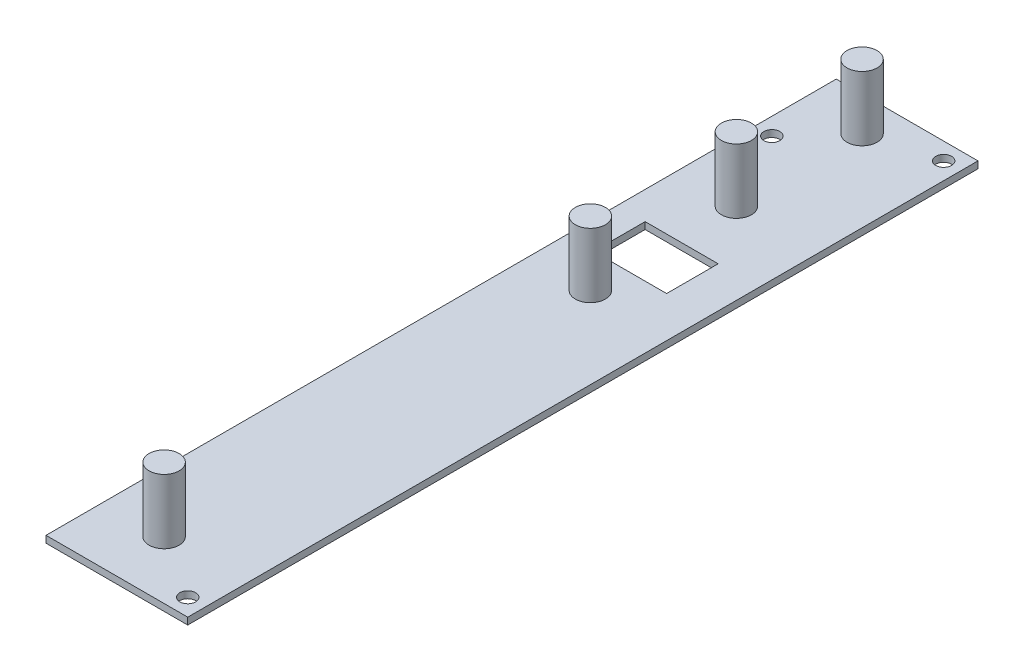
ISO-10303-21;
HEADER;
FILE_DESCRIPTION(('STEP AP214'),'2;1');
FILE_NAME('part.step','',(''),(''),'','','');
FILE_SCHEMA(('AUTOMOTIVE_DESIGN { 1 0 10303 214 1 1 1 1 }'));
ENDSEC;
DATA;
#1=APPLICATION_CONTEXT('core data for automotive mechanical design processes');
#2=APPLICATION_PROTOCOL_DEFINITION('international standard','automotive_design',2000,#1);
#3=PRODUCT_CONTEXT('',#1,'mechanical');
#4=PRODUCT('Part','Part','',(#3));
#5=PRODUCT_RELATED_PRODUCT_CATEGORY('part','',(#4));
#6=PRODUCT_DEFINITION_FORMATION('','',#4);
#7=PRODUCT_DEFINITION_CONTEXT('part definition',#1,'design');
#8=PRODUCT_DEFINITION('design','',#6,#7);
#9=PRODUCT_DEFINITION_SHAPE('','',#8);
#10=(LENGTH_UNIT() NAMED_UNIT(*) SI_UNIT(.MILLI.,.METRE.));
#11=(NAMED_UNIT(*) PLANE_ANGLE_UNIT() SI_UNIT($,.RADIAN.));
#12=(NAMED_UNIT(*) SI_UNIT($,.STERADIAN.) SOLID_ANGLE_UNIT());
#13=UNCERTAINTY_MEASURE_WITH_UNIT(LENGTH_MEASURE(1.E-05),#10,'distance_accuracy_value','');
#14=(GEOMETRIC_REPRESENTATION_CONTEXT(3) GLOBAL_UNCERTAINTY_ASSIGNED_CONTEXT((#13)) GLOBAL_UNIT_ASSIGNED_CONTEXT((#10,
#11,#12)) REPRESENTATION_CONTEXT('',''));
#15=CARTESIAN_POINT('',(0.,0.,0.));
#16=DIRECTION('',(0.,0.,1.));
#17=DIRECTION('',(1.,0.,0.));
#18=AXIS2_PLACEMENT_3D('',#15,#16,#17);
#19=CARTESIAN_POINT('',(16.5,1.6,-92.));
#20=DIRECTION('',(-1.,0.,0.));
#21=DIRECTION('',(0.,0.,1.));
#22=AXIS2_PLACEMENT_3D('',#19,#20,#21);
#23=PLANE('',#22);
#24=DIRECTION('',(0.,0.,-1.));
#25=VECTOR('',#24,1.);
#26=CARTESIAN_POINT('',(16.5,0.,-92.));
#27=LINE('',#26,#25);
#28=CARTESIAN_POINT('',(16.5,0.,92.));
#29=VERTEX_POINT('',#28);
#30=CARTESIAN_POINT('',(16.5,0.,-92.));
#31=VERTEX_POINT('',#30);
#32=EDGE_CURVE('E173',#29,#31,#27,.T.);
#33=ORIENTED_EDGE('',*,*,#32,.T.);
#34=DIRECTION('',(0.,-1.,0.));
#35=VECTOR('',#34,1.);
#36=CARTESIAN_POINT('',(16.5,1.6,-92.));
#37=LINE('',#36,#35);
#38=CARTESIAN_POINT('',(16.5,1.6,-92.));
#39=VERTEX_POINT('',#38);
#40=EDGE_CURVE('E11',#39,#31,#37,.T.);
#41=ORIENTED_EDGE('',*,*,#40,.F.);
#42=DIRECTION('',(0.,0.,-1.));
#43=VECTOR('',#42,1.);
#44=CARTESIAN_POINT('',(16.5,1.6,-92.));
#45=LINE('',#44,#43);
#46=CARTESIAN_POINT('',(16.5,1.6,92.));
#47=VERTEX_POINT('',#46);
#48=EDGE_CURVE('E176',#47,#39,#45,.T.);
#49=ORIENTED_EDGE('',*,*,#48,.F.);
#50=DIRECTION('',(0.,-1.,0.));
#51=VECTOR('',#50,1.);
#52=CARTESIAN_POINT('',(16.5,1.6,92.));
#53=LINE('',#52,#51);
#54=EDGE_CURVE('E186',#47,#29,#53,.T.);
#55=ORIENTED_EDGE('',*,*,#54,.T.);
#56=EDGE_LOOP('',(#33,#41,#49,#55));
#57=FACE_BOUND('',#56,.T.);
#58=ADVANCED_FACE('F33',(#57),#23,.F.);
#59=CARTESIAN_POINT('',(-16.5,1.6,-92.));
#60=DIRECTION('',(0.,0.,1.));
#61=DIRECTION('',(1.,0.,0.));
#62=AXIS2_PLACEMENT_3D('',#59,#60,#61);
#63=PLANE('',#62);
#64=DIRECTION('',(-1.,0.,0.));
#65=VECTOR('',#64,1.);
#66=CARTESIAN_POINT('',(-16.5,0.,-92.));
#67=LINE('',#66,#65);
#68=CARTESIAN_POINT('',(-16.5,0.,-92.));
#69=VERTEX_POINT('',#68);
#70=EDGE_CURVE('E189',#31,#69,#67,.T.);
#71=ORIENTED_EDGE('',*,*,#70,.T.);
#72=DIRECTION('',(0.,-1.,0.));
#73=VECTOR('',#72,1.);
#74=CARTESIAN_POINT('',(-16.5,1.6,-92.));
#75=LINE('',#74,#73);
#76=CARTESIAN_POINT('',(-16.5,1.6,-92.));
#77=VERTEX_POINT('',#76);
#78=EDGE_CURVE('E40',#77,#69,#75,.T.);
#79=ORIENTED_EDGE('',*,*,#78,.F.);
#80=DIRECTION('',(-1.,0.,0.));
#81=VECTOR('',#80,1.);
#82=CARTESIAN_POINT('',(-16.5,1.6,-92.));
#83=LINE('',#82,#81);
#84=EDGE_CURVE('E179',#39,#77,#83,.T.);
#85=ORIENTED_EDGE('',*,*,#84,.F.);
#86=ORIENTED_EDGE('',*,*,#40,.T.);
#87=EDGE_LOOP('',(#71,#79,#85,#86));
#88=FACE_BOUND('',#87,.T.);
#89=ADVANCED_FACE('F218',(#88),#63,.F.);
#90=CARTESIAN_POINT('',(-16.5,1.6,-92.));
#91=DIRECTION('',(1.,0.,0.));
#92=DIRECTION('',(0.,0.,-1.));
#93=AXIS2_PLACEMENT_3D('',#90,#91,#92);
#94=PLANE('',#93);
#95=DIRECTION('',(0.,0.,1.));
#96=VECTOR('',#95,1.);
#97=CARTESIAN_POINT('',(-16.5,0.,-92.));
#98=LINE('',#97,#96);
#99=CARTESIAN_POINT('',(-16.5,0.,92.));
#100=VERTEX_POINT('',#99);
#101=EDGE_CURVE('E191',#69,#100,#98,.T.);
#102=ORIENTED_EDGE('',*,*,#101,.T.);
#103=DIRECTION('',(0.,-1.,0.));
#104=VECTOR('',#103,1.);
#105=CARTESIAN_POINT('',(-16.5,1.6,92.));
#106=LINE('',#105,#104);
#107=CARTESIAN_POINT('',(-16.5,1.6,92.));
#108=VERTEX_POINT('',#107);
#109=EDGE_CURVE('E196',#108,#100,#106,.T.);
#110=ORIENTED_EDGE('',*,*,#109,.F.);
#111=DIRECTION('',(0.,0.,1.));
#112=VECTOR('',#111,1.);
#113=CARTESIAN_POINT('',(-16.5,1.6,-92.));
#114=LINE('',#113,#112);
#115=EDGE_CURVE('E182',#77,#108,#114,.T.);
#116=ORIENTED_EDGE('',*,*,#115,.F.);
#117=ORIENTED_EDGE('',*,*,#78,.T.);
#118=EDGE_LOOP('',(#102,#110,#116,#117));
#119=FACE_BOUND('',#118,.T.);
#120=ADVANCED_FACE('F203',(#119),#94,.F.);
#121=CARTESIAN_POINT('',(-16.5,1.6,92.));
#122=DIRECTION('',(0.,0.,-1.));
#123=DIRECTION('',(-1.,0.,0.));
#124=AXIS2_PLACEMENT_3D('',#121,#122,#123);
#125=PLANE('',#124);
#126=DIRECTION('',(1.,0.,0.));
#127=VECTOR('',#126,1.);
#128=CARTESIAN_POINT('',(-16.5,0.,92.));
#129=LINE('',#128,#127);
#130=EDGE_CURVE('E180',#100,#29,#129,.T.);
#131=ORIENTED_EDGE('',*,*,#130,.T.);
#132=ORIENTED_EDGE('',*,*,#54,.F.);
#133=DIRECTION('',(1.,0.,0.));
#134=VECTOR('',#133,1.);
#135=CARTESIAN_POINT('',(-16.5,1.6,92.));
#136=LINE('',#135,#134);
#137=EDGE_CURVE('E184',#108,#47,#136,.T.);
#138=ORIENTED_EDGE('',*,*,#137,.F.);
#139=ORIENTED_EDGE('',*,*,#109,.T.);
#140=EDGE_LOOP('',(#131,#132,#138,#139));
#141=FACE_BOUND('',#140,.T.);
#142=ADVANCED_FACE('F211',(#141),#125,.F.);
#143=CARTESIAN_POINT('',(0.,1.6,0.));
#144=DIRECTION('',(0.,1.,0.));
#145=DIRECTION('',(0.,0.,1.));
#146=AXIS2_PLACEMENT_3D('',#143,#144,#145);
#147=PLANE('',#146);
#148=DIRECTION('',(0.,0.,1.));
#149=VECTOR('',#148,1.);
#150=CARTESIAN_POINT('',(-10.,1.6,-41.));
#151=LINE('',#150,#149);
#152=CARTESIAN_POINT('',(-10.,1.6,-41.));
#153=VERTEX_POINT('',#152);
#154=CARTESIAN_POINT('',(-10.,1.6,-29.));
#155=VERTEX_POINT('',#154);
#156=EDGE_CURVE('E47',#153,#155,#151,.T.);
#157=ORIENTED_EDGE('',*,*,#156,.F.);
#158=DIRECTION('',(-1.,0.,0.));
#159=VECTOR('',#158,1.);
#160=CARTESIAN_POINT('',(-10.,1.6,-41.));
#161=LINE('',#160,#159);
#162=CARTESIAN_POINT('',(6.99999999999998,1.6,-41.));
#163=VERTEX_POINT('',#162);
#164=EDGE_CURVE('E115',#163,#153,#161,.T.);
#165=ORIENTED_EDGE('',*,*,#164,.F.);
#166=DIRECTION('',(0.,0.,-1.));
#167=VECTOR('',#166,1.);
#168=CARTESIAN_POINT('',(6.99999999999998,1.6,-41.));
#169=LINE('',#168,#167);
#170=CARTESIAN_POINT('',(6.99999999999998,1.6,-29.));
#171=VERTEX_POINT('',#170);
#172=EDGE_CURVE('E118',#171,#163,#169,.T.);
#173=ORIENTED_EDGE('',*,*,#172,.F.);
#174=DIRECTION('',(1.,0.,0.));
#175=VECTOR('',#174,1.);
#176=CARTESIAN_POINT('',(-10.,1.6,-29.));
#177=LINE('',#176,#175);
#178=EDGE_CURVE('E124',#155,#171,#177,.T.);
#179=ORIENTED_EDGE('',*,*,#178,.F.);
#180=EDGE_LOOP('',(#157,#165,#173,#179));
#181=FACE_BOUND('',#180,.T.);
#182=CARTESIAN_POINT('',(-2.50000000000002,1.6,78.5));
#183=DIRECTION('',(0.,1.,0.));
#184=DIRECTION('',(0.,0.,1.));
#185=AXIS2_PLACEMENT_3D('',#182,#183,#184);
#186=CIRCLE('',#185,3.5);
#187=CARTESIAN_POINT('',(-2.50000000000002,1.6,82.));
#188=VERTEX_POINT('',#187);
#189=EDGE_CURVE('E130',#188,#188,#186,.T.);
#190=ORIENTED_EDGE('',*,*,#189,.F.);
#191=EDGE_LOOP('',(#190));
#192=FACE_BOUND('',#191,.T.);
#193=CARTESIAN_POINT('',(-2.50000000000002,1.6,-54.75));
#194=DIRECTION('',(0.,1.,0.));
#195=DIRECTION('',(0.,0.,1.));
#196=AXIS2_PLACEMENT_3D('',#193,#194,#195);
#197=CIRCLE('',#196,3.5);
#198=CARTESIAN_POINT('',(-2.50000000000002,1.6,-51.25));
#199=VERTEX_POINT('',#198);
#200=EDGE_CURVE('E137',#199,#199,#197,.T.);
#201=ORIENTED_EDGE('',*,*,#200,.F.);
#202=EDGE_LOOP('',(#201));
#203=FACE_BOUND('',#202,.T.);
#204=CARTESIAN_POINT('',(-2.50000000000002,1.6,-20.75));
#205=DIRECTION('',(0.,1.,0.));
#206=DIRECTION('',(0.,0.,1.));
#207=AXIS2_PLACEMENT_3D('',#204,#205,#206);
#208=CIRCLE('',#207,3.5);
#209=CARTESIAN_POINT('',(-2.50000000000002,1.6,-17.25));
#210=VERTEX_POINT('',#209);
#211=EDGE_CURVE('E143',#210,#210,#208,.T.);
#212=ORIENTED_EDGE('',*,*,#211,.F.);
#213=EDGE_LOOP('',(#212));
#214=FACE_BOUND('',#213,.T.);
#215=CARTESIAN_POINT('',(-2.50000000000002,1.6,-84.));
#216=DIRECTION('',(0.,1.,0.));
#217=DIRECTION('',(0.,0.,1.));
#218=AXIS2_PLACEMENT_3D('',#215,#216,#217);
#219=CIRCLE('',#218,3.5);
#220=CARTESIAN_POINT('',(-2.50000000000002,1.6,-80.5));
#221=VERTEX_POINT('',#220);
#222=EDGE_CURVE('E149',#221,#221,#219,.T.);
#223=ORIENTED_EDGE('',*,*,#222,.F.);
#224=EDGE_LOOP('',(#223));
#225=FACE_BOUND('',#224,.T.);
#226=CARTESIAN_POINT('',(12.5,1.6,-88.));
#227=DIRECTION('',(0.,1.,0.));
#228=DIRECTION('',(0.,0.,1.));
#229=AXIS2_PLACEMENT_3D('',#226,#227,#228);
#230=CIRCLE('',#229,1.85000000000001);
#231=CARTESIAN_POINT('',(12.5,1.6,-86.15));
#232=VERTEX_POINT('',#231);
#233=EDGE_CURVE('E162',#232,#232,#230,.T.);
#234=ORIENTED_EDGE('',*,*,#233,.F.);
#235=EDGE_LOOP('',(#234));
#236=FACE_BOUND('',#235,.T.);
#237=CARTESIAN_POINT('',(12.5,1.6,88.));
#238=DIRECTION('',(0.,1.,0.));
#239=DIRECTION('',(0.,0.,1.));
#240=AXIS2_PLACEMENT_3D('',#237,#238,#239);
#241=CIRCLE('',#240,1.85000000000001);
#242=CARTESIAN_POINT('',(12.5,1.6,89.85));
#243=VERTEX_POINT('',#242);
#244=EDGE_CURVE('E155',#243,#243,#241,.T.);
#245=ORIENTED_EDGE('',*,*,#244,.F.);
#246=EDGE_LOOP('',(#245));
#247=FACE_BOUND('',#246,.T.);
#248=CARTESIAN_POINT('',(-12.5,1.6,-73.));
#249=DIRECTION('',(0.,1.,0.));
#250=DIRECTION('',(0.,0.,1.));
#251=AXIS2_PLACEMENT_3D('',#248,#249,#250);
#252=CIRCLE('',#251,1.85000000000001);
#253=CARTESIAN_POINT('',(-12.5,1.6,-71.15));
#254=VERTEX_POINT('',#253);
#255=EDGE_CURVE('E161',#254,#254,#252,.T.);
#256=ORIENTED_EDGE('',*,*,#255,.F.);
#257=EDGE_LOOP('',(#256));
#258=FACE_BOUND('',#257,.T.);
#259=ORIENTED_EDGE('',*,*,#48,.T.);
#260=ORIENTED_EDGE('',*,*,#84,.T.);
#261=ORIENTED_EDGE('',*,*,#115,.T.);
#262=ORIENTED_EDGE('',*,*,#137,.T.);
#263=EDGE_LOOP('',(#259,#260,#261,#262));
#264=FACE_BOUND('',#263,.T.);
#265=ADVANCED_FACE('F217',(#181,#192,#203,#214,#225,#236,#247,#258,#264),#147,.T.);
#266=CARTESIAN_POINT('',(0.,0.,0.));
#267=DIRECTION('',(0.,1.,0.));
#268=DIRECTION('',(0.,0.,1.));
#269=AXIS2_PLACEMENT_3D('',#266,#267,#268);
#270=PLANE('',#269);
#271=DIRECTION('',(-1.,0.,0.));
#272=VECTOR('',#271,1.);
#273=CARTESIAN_POINT('',(-10.,0.,-41.));
#274=LINE('',#273,#272);
#275=CARTESIAN_POINT('',(6.99999999999998,0.,-41.));
#276=VERTEX_POINT('',#275);
#277=CARTESIAN_POINT('',(-10.,0.,-41.));
#278=VERTEX_POINT('',#277);
#279=EDGE_CURVE('E105',#276,#278,#274,.T.);
#280=ORIENTED_EDGE('',*,*,#279,.T.);
#281=DIRECTION('',(0.,0.,1.));
#282=VECTOR('',#281,1.);
#283=CARTESIAN_POINT('',(-10.,0.,-41.));
#284=LINE('',#283,#282);
#285=CARTESIAN_POINT('',(-10.,0.,-29.));
#286=VERTEX_POINT('',#285);
#287=EDGE_CURVE('E99',#278,#286,#284,.T.);
#288=ORIENTED_EDGE('',*,*,#287,.T.);
#289=DIRECTION('',(1.,0.,0.));
#290=VECTOR('',#289,1.);
#291=CARTESIAN_POINT('',(-10.,0.,-29.));
#292=LINE('',#291,#290);
#293=CARTESIAN_POINT('',(6.99999999999998,0.,-29.));
#294=VERTEX_POINT('',#293);
#295=EDGE_CURVE('E108',#286,#294,#292,.T.);
#296=ORIENTED_EDGE('',*,*,#295,.T.);
#297=DIRECTION('',(0.,0.,-1.));
#298=VECTOR('',#297,1.);
#299=CARTESIAN_POINT('',(6.99999999999998,0.,-41.));
#300=LINE('',#299,#298);
#301=EDGE_CURVE('E55',#294,#276,#300,.T.);
#302=ORIENTED_EDGE('',*,*,#301,.T.);
#303=EDGE_LOOP('',(#280,#288,#296,#302));
#304=FACE_BOUND('',#303,.T.);
#305=CARTESIAN_POINT('',(12.5,0.,-88.));
#306=DIRECTION('',(0.,1.,0.));
#307=DIRECTION('',(0.,0.,1.));
#308=AXIS2_PLACEMENT_3D('',#305,#306,#307);
#309=CIRCLE('',#308,1.85000000000001);
#310=CARTESIAN_POINT('',(12.5,0.,-86.15));
#311=VERTEX_POINT('',#310);
#312=EDGE_CURVE('E158',#311,#311,#309,.T.);
#313=ORIENTED_EDGE('',*,*,#312,.T.);
#314=EDGE_LOOP('',(#313));
#315=FACE_BOUND('',#314,.T.);
#316=CARTESIAN_POINT('',(12.5,0.,88.));
#317=DIRECTION('',(0.,1.,0.));
#318=DIRECTION('',(0.,0.,1.));
#319=AXIS2_PLACEMENT_3D('',#316,#317,#318);
#320=CIRCLE('',#319,1.85000000000001);
#321=CARTESIAN_POINT('',(12.5,0.,89.85));
#322=VERTEX_POINT('',#321);
#323=EDGE_CURVE('E165',#322,#322,#320,.T.);
#324=ORIENTED_EDGE('',*,*,#323,.T.);
#325=EDGE_LOOP('',(#324));
#326=FACE_BOUND('',#325,.T.);
#327=CARTESIAN_POINT('',(-12.5,0.,-73.));
#328=DIRECTION('',(0.,1.,0.));
#329=DIRECTION('',(0.,0.,1.));
#330=AXIS2_PLACEMENT_3D('',#327,#328,#329);
#331=CIRCLE('',#330,1.85000000000001);
#332=CARTESIAN_POINT('',(-12.5,0.,-71.15));
#333=VERTEX_POINT('',#332);
#334=EDGE_CURVE('E170',#333,#333,#331,.T.);
#335=ORIENTED_EDGE('',*,*,#334,.T.);
#336=EDGE_LOOP('',(#335));
#337=FACE_BOUND('',#336,.T.);
#338=ORIENTED_EDGE('',*,*,#32,.F.);
#339=ORIENTED_EDGE('',*,*,#130,.F.);
#340=ORIENTED_EDGE('',*,*,#101,.F.);
#341=ORIENTED_EDGE('',*,*,#70,.F.);
#342=EDGE_LOOP('',(#338,#339,#340,#341));
#343=FACE_BOUND('',#342,.T.);
#344=ADVANCED_FACE('F112',(#304,#315,#326,#337,#343),#270,.F.);
#345=CARTESIAN_POINT('',(-12.5,0.,-73.));
#346=DIRECTION('',(0.,1.,0.));
#347=DIRECTION('',(0.,0.,1.));
#348=AXIS2_PLACEMENT_3D('',#345,#346,#347);
#349=CYLINDRICAL_SURFACE('',#348,1.85000000000001);
#350=ORIENTED_EDGE('',*,*,#334,.F.);
#351=EDGE_LOOP('',(#350));
#352=FACE_BOUND('',#351,.T.);
#353=ORIENTED_EDGE('',*,*,#255,.T.);
#354=EDGE_LOOP('',(#353));
#355=FACE_BOUND('',#354,.T.);
#356=ADVANCED_FACE('F230',(#352,#355),#349,.F.);
#357=CARTESIAN_POINT('',(12.5,0.,88.));
#358=DIRECTION('',(0.,1.,0.));
#359=DIRECTION('',(0.,0.,1.));
#360=AXIS2_PLACEMENT_3D('',#357,#358,#359);
#361=CYLINDRICAL_SURFACE('',#360,1.85000000000001);
#362=ORIENTED_EDGE('',*,*,#323,.F.);
#363=EDGE_LOOP('',(#362));
#364=FACE_BOUND('',#363,.T.);
#365=ORIENTED_EDGE('',*,*,#244,.T.);
#366=EDGE_LOOP('',(#365));
#367=FACE_BOUND('',#366,.T.);
#368=ADVANCED_FACE('F236',(#364,#367),#361,.F.);
#369=CARTESIAN_POINT('',(12.5,0.,-88.));
#370=DIRECTION('',(0.,1.,0.));
#371=DIRECTION('',(0.,0.,1.));
#372=AXIS2_PLACEMENT_3D('',#369,#370,#371);
#373=CYLINDRICAL_SURFACE('',#372,1.85000000000001);
#374=ORIENTED_EDGE('',*,*,#312,.F.);
#375=EDGE_LOOP('',(#374));
#376=FACE_BOUND('',#375,.T.);
#377=ORIENTED_EDGE('',*,*,#233,.T.);
#378=EDGE_LOOP('',(#377));
#379=FACE_BOUND('',#378,.T.);
#380=ADVANCED_FACE('F240',(#376,#379),#373,.F.);
#381=CARTESIAN_POINT('',(-2.50000000000002,16.6,-84.));
#382=DIRECTION('',(0.,-1.,0.));
#383=DIRECTION('',(0.,0.,-1.));
#384=AXIS2_PLACEMENT_3D('',#381,#382,#383);
#385=CYLINDRICAL_SURFACE('',#384,3.5);
#386=CARTESIAN_POINT('',(-2.50000000000002,16.6,-84.));
#387=DIRECTION('',(0.,1.,0.));
#388=DIRECTION('',(0.,0.,1.));
#389=AXIS2_PLACEMENT_3D('',#386,#387,#388);
#390=CIRCLE('',#389,3.5);
#391=CARTESIAN_POINT('',(-2.50000000000002,16.6,-80.5));
#392=VERTEX_POINT('',#391);
#393=EDGE_CURVE('E152',#392,#392,#390,.T.);
#394=ORIENTED_EDGE('',*,*,#393,.F.);
#395=EDGE_LOOP('',(#394));
#396=FACE_BOUND('',#395,.T.);
#397=ORIENTED_EDGE('',*,*,#222,.T.);
#398=EDGE_LOOP('',(#397));
#399=FACE_BOUND('',#398,.T.);
#400=ADVANCED_FACE('F244',(#396,#399),#385,.T.);
#401=CARTESIAN_POINT('',(-2.50000000000002,16.6,-84.));
#402=DIRECTION('',(0.,1.,0.));
#403=DIRECTION('',(0.,0.,1.));
#404=AXIS2_PLACEMENT_3D('',#401,#402,#403);
#405=PLANE('',#404);
#406=ORIENTED_EDGE('',*,*,#393,.T.);
#407=EDGE_LOOP('',(#406));
#408=FACE_BOUND('',#407,.T.);
#409=ADVANCED_FACE('F248',(#408),#405,.T.);
#410=CARTESIAN_POINT('',(-2.50000000000002,16.6,-20.75));
#411=DIRECTION('',(0.,-1.,0.));
#412=DIRECTION('',(0.,0.,-1.));
#413=AXIS2_PLACEMENT_3D('',#410,#411,#412);
#414=CYLINDRICAL_SURFACE('',#413,3.5);
#415=CARTESIAN_POINT('',(-2.50000000000002,16.6,-20.75));
#416=DIRECTION('',(0.,1.,0.));
#417=DIRECTION('',(0.,0.,1.));
#418=AXIS2_PLACEMENT_3D('',#415,#416,#417);
#419=CIRCLE('',#418,3.5);
#420=CARTESIAN_POINT('',(-2.50000000000002,16.6,-17.25));
#421=VERTEX_POINT('',#420);
#422=EDGE_CURVE('E146',#421,#421,#419,.T.);
#423=ORIENTED_EDGE('',*,*,#422,.F.);
#424=EDGE_LOOP('',(#423));
#425=FACE_BOUND('',#424,.T.);
#426=ORIENTED_EDGE('',*,*,#211,.T.);
#427=EDGE_LOOP('',(#426));
#428=FACE_BOUND('',#427,.T.);
#429=ADVANCED_FACE('F252',(#425,#428),#414,.T.);
#430=CARTESIAN_POINT('',(-2.50000000000002,16.6,-20.75));
#431=DIRECTION('',(0.,1.,0.));
#432=DIRECTION('',(0.,0.,1.));
#433=AXIS2_PLACEMENT_3D('',#430,#431,#432);
#434=PLANE('',#433);
#435=ORIENTED_EDGE('',*,*,#422,.T.);
#436=EDGE_LOOP('',(#435));
#437=FACE_BOUND('',#436,.T.);
#438=ADVANCED_FACE('F256',(#437),#434,.T.);
#439=CARTESIAN_POINT('',(-2.50000000000002,16.6,-54.75));
#440=DIRECTION('',(0.,-1.,0.));
#441=DIRECTION('',(0.,0.,-1.));
#442=AXIS2_PLACEMENT_3D('',#439,#440,#441);
#443=CYLINDRICAL_SURFACE('',#442,3.5);
#444=CARTESIAN_POINT('',(-2.50000000000002,16.6,-54.75));
#445=DIRECTION('',(0.,1.,0.));
#446=DIRECTION('',(0.,0.,1.));
#447=AXIS2_PLACEMENT_3D('',#444,#445,#446);
#448=CIRCLE('',#447,3.5);
#449=CARTESIAN_POINT('',(-2.50000000000002,16.6,-51.25));
#450=VERTEX_POINT('',#449);
#451=EDGE_CURVE('E140',#450,#450,#448,.T.);
#452=ORIENTED_EDGE('',*,*,#451,.F.);
#453=EDGE_LOOP('',(#452));
#454=FACE_BOUND('',#453,.T.);
#455=ORIENTED_EDGE('',*,*,#200,.T.);
#456=EDGE_LOOP('',(#455));
#457=FACE_BOUND('',#456,.T.);
#458=ADVANCED_FACE('F260',(#454,#457),#443,.T.);
#459=CARTESIAN_POINT('',(-2.50000000000002,16.6,-54.75));
#460=DIRECTION('',(0.,1.,0.));
#461=DIRECTION('',(0.,0.,1.));
#462=AXIS2_PLACEMENT_3D('',#459,#460,#461);
#463=PLANE('',#462);
#464=ORIENTED_EDGE('',*,*,#451,.T.);
#465=EDGE_LOOP('',(#464));
#466=FACE_BOUND('',#465,.T.);
#467=ADVANCED_FACE('F264',(#466),#463,.T.);
#468=CARTESIAN_POINT('',(-2.50000000000002,16.6,78.5));
#469=DIRECTION('',(0.,-1.,0.));
#470=DIRECTION('',(0.,0.,-1.));
#471=AXIS2_PLACEMENT_3D('',#468,#469,#470);
#472=CYLINDRICAL_SURFACE('',#471,3.5);
#473=CARTESIAN_POINT('',(-2.50000000000002,16.6,78.5));
#474=DIRECTION('',(0.,1.,0.));
#475=DIRECTION('',(0.,0.,1.));
#476=AXIS2_PLACEMENT_3D('',#473,#474,#475);
#477=CIRCLE('',#476,3.5);
#478=CARTESIAN_POINT('',(-2.50000000000002,16.6,82.));
#479=VERTEX_POINT('',#478);
#480=EDGE_CURVE('E134',#479,#479,#477,.T.);
#481=ORIENTED_EDGE('',*,*,#480,.F.);
#482=EDGE_LOOP('',(#481));
#483=FACE_BOUND('',#482,.T.);
#484=ORIENTED_EDGE('',*,*,#189,.T.);
#485=EDGE_LOOP('',(#484));
#486=FACE_BOUND('',#485,.T.);
#487=ADVANCED_FACE('F268',(#483,#486),#472,.T.);
#488=CARTESIAN_POINT('',(-2.50000000000002,16.6,78.5));
#489=DIRECTION('',(0.,1.,0.));
#490=DIRECTION('',(0.,0.,1.));
#491=AXIS2_PLACEMENT_3D('',#488,#489,#490);
#492=PLANE('',#491);
#493=ORIENTED_EDGE('',*,*,#480,.T.);
#494=EDGE_LOOP('',(#493));
#495=FACE_BOUND('',#494,.T.);
#496=ADVANCED_FACE('F272',(#495),#492,.T.);
#497=CARTESIAN_POINT('',(-10.,0.,-41.));
#498=DIRECTION('',(-1.,0.,0.));
#499=DIRECTION('',(0.,0.,1.));
#500=AXIS2_PLACEMENT_3D('',#497,#498,#499);
#501=PLANE('',#500);
#502=ORIENTED_EDGE('',*,*,#156,.T.);
#503=DIRECTION('',(0.,1.,0.));
#504=VECTOR('',#503,1.);
#505=CARTESIAN_POINT('',(-10.,0.,-29.));
#506=LINE('',#505,#504);
#507=EDGE_CURVE('E95',#286,#155,#506,.T.);
#508=ORIENTED_EDGE('',*,*,#507,.F.);
#509=ORIENTED_EDGE('',*,*,#287,.F.);
#510=DIRECTION('',(0.,1.,0.));
#511=VECTOR('',#510,1.);
#512=CARTESIAN_POINT('',(-10.,0.,-41.));
#513=LINE('',#512,#511);
#514=EDGE_CURVE('E128',#278,#153,#513,.T.);
#515=ORIENTED_EDGE('',*,*,#514,.T.);
#516=EDGE_LOOP('',(#502,#508,#509,#515));
#517=FACE_BOUND('',#516,.T.);
#518=ADVANCED_FACE('F97',(#517),#501,.F.);
#519=CARTESIAN_POINT('',(-10.,0.,-41.));
#520=DIRECTION('',(0.,0.,-1.));
#521=DIRECTION('',(-1.,0.,0.));
#522=AXIS2_PLACEMENT_3D('',#519,#520,#521);
#523=PLANE('',#522);
#524=ORIENTED_EDGE('',*,*,#164,.T.);
#525=ORIENTED_EDGE('',*,*,#514,.F.);
#526=ORIENTED_EDGE('',*,*,#279,.F.);
#527=DIRECTION('',(0.,1.,0.));
#528=VECTOR('',#527,1.);
#529=CARTESIAN_POINT('',(6.99999999999998,0.,-41.));
#530=LINE('',#529,#528);
#531=EDGE_CURVE('E131',#276,#163,#530,.T.);
#532=ORIENTED_EDGE('',*,*,#531,.T.);
#533=EDGE_LOOP('',(#524,#525,#526,#532));
#534=FACE_BOUND('',#533,.T.);
#535=ADVANCED_FACE('F279',(#534),#523,.F.);
#536=CARTESIAN_POINT('',(6.99999999999998,0.,-41.));
#537=DIRECTION('',(1.,0.,0.));
#538=DIRECTION('',(0.,0.,-1.));
#539=AXIS2_PLACEMENT_3D('',#536,#537,#538);
#540=PLANE('',#539);
#541=ORIENTED_EDGE('',*,*,#172,.T.);
#542=ORIENTED_EDGE('',*,*,#531,.F.);
#543=ORIENTED_EDGE('',*,*,#301,.F.);
#544=DIRECTION('',(0.,1.,0.));
#545=VECTOR('',#544,1.);
#546=CARTESIAN_POINT('',(6.99999999999998,0.,-29.));
#547=LINE('',#546,#545);
#548=EDGE_CURVE('E104',#294,#171,#547,.T.);
#549=ORIENTED_EDGE('',*,*,#548,.T.);
#550=EDGE_LOOP('',(#541,#542,#543,#549));
#551=FACE_BOUND('',#550,.T.);
#552=ADVANCED_FACE('F282',(#551),#540,.F.);
#553=CARTESIAN_POINT('',(-10.,0.,-29.));
#554=DIRECTION('',(0.,0.,1.));
#555=DIRECTION('',(1.,0.,0.));
#556=AXIS2_PLACEMENT_3D('',#553,#554,#555);
#557=PLANE('',#556);
#558=ORIENTED_EDGE('',*,*,#178,.T.);
#559=ORIENTED_EDGE('',*,*,#548,.F.);
#560=ORIENTED_EDGE('',*,*,#295,.F.);
#561=ORIENTED_EDGE('',*,*,#507,.T.);
#562=EDGE_LOOP('',(#558,#559,#560,#561));
#563=FACE_BOUND('',#562,.T.);
#564=ADVANCED_FACE('F109',(#563),#557,.F.);
#565=CLOSED_SHELL('',(#58,#89,#120,#142,#265,#344,#356,#368,#380,#400,#409,#429,#438,#458,#467,
#487,#496,#518,#535,#552,#564));
#566=MANIFOLD_SOLID_BREP('B2',#565);
#567=ADVANCED_BREP_SHAPE_REPRESENTATION('',(#18,#566),#14);
#568=SHAPE_DEFINITION_REPRESENTATION(#9,#567);
ENDSEC;
END-ISO-10303-21;
